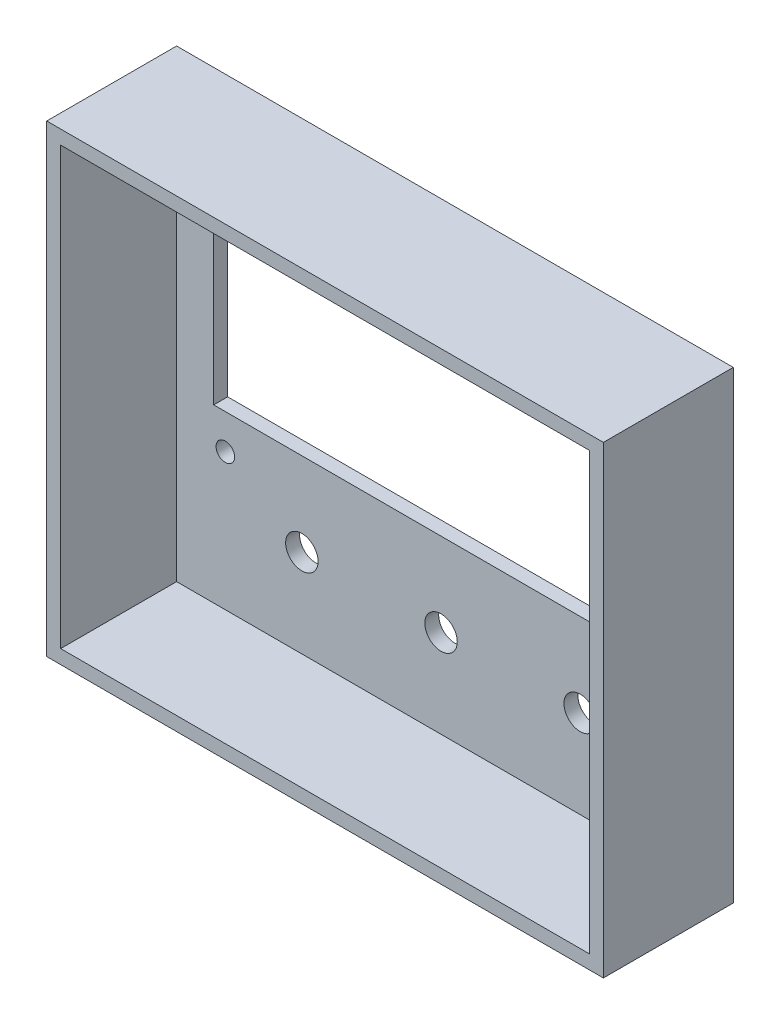
ISO-10303-21;
HEADER;
FILE_DESCRIPTION(('STEP AP214'),'2;1');
FILE_NAME('part.step','',(''),(''),'','','');
FILE_SCHEMA(('AUTOMOTIVE_DESIGN { 1 0 10303 214 1 1 1 1 }'));
ENDSEC;
DATA;
#1=APPLICATION_CONTEXT('core data for automotive mechanical design processes');
#2=APPLICATION_PROTOCOL_DEFINITION('international standard','automotive_design',2000,#1);
#3=PRODUCT_CONTEXT('',#1,'mechanical');
#4=PRODUCT('Part','Part','',(#3));
#5=PRODUCT_RELATED_PRODUCT_CATEGORY('part','',(#4));
#6=PRODUCT_DEFINITION_FORMATION('','',#4);
#7=PRODUCT_DEFINITION_CONTEXT('part definition',#1,'design');
#8=PRODUCT_DEFINITION('design','',#6,#7);
#9=PRODUCT_DEFINITION_SHAPE('','',#8);
#10=(LENGTH_UNIT() NAMED_UNIT(*) SI_UNIT(.MILLI.,.METRE.));
#11=(NAMED_UNIT(*) PLANE_ANGLE_UNIT() SI_UNIT($,.RADIAN.));
#12=(NAMED_UNIT(*) SI_UNIT($,.STERADIAN.) SOLID_ANGLE_UNIT());
#13=UNCERTAINTY_MEASURE_WITH_UNIT(LENGTH_MEASURE(1.E-05),#10,'distance_accuracy_value','');
#14=(GEOMETRIC_REPRESENTATION_CONTEXT(3) GLOBAL_UNCERTAINTY_ASSIGNED_CONTEXT((#13)) GLOBAL_UNIT_ASSIGNED_CONTEXT((#10,
#11,#12)) REPRESENTATION_CONTEXT('',''));
#15=CARTESIAN_POINT('',(0.,0.,0.));
#16=DIRECTION('',(0.,0.,1.));
#17=DIRECTION('',(1.,0.,0.));
#18=AXIS2_PLACEMENT_3D('',#15,#16,#17);
#19=CARTESIAN_POINT('',(0.,0.,3.));
#20=DIRECTION('',(0.,0.,-1.));
#21=DIRECTION('',(-1.,0.,0.));
#22=AXIS2_PLACEMENT_3D('',#19,#20,#21);
#23=PLANE('',#22);
#24=DIRECTION('',(-1.,0.,0.));
#25=VECTOR('',#24,1.);
#26=CARTESIAN_POINT('',(3.,97.,3.));
#27=LINE('',#26,#25);
#28=CARTESIAN_POINT('',(117.,97.,3.));
#29=VERTEX_POINT('',#28);
#30=CARTESIAN_POINT('',(3.,97.,3.));
#31=VERTEX_POINT('',#30);
#32=EDGE_CURVE('E134',#29,#31,#27,.T.);
#33=ORIENTED_EDGE('',*,*,#32,.T.);
#34=DIRECTION('',(0.,-1.,0.));
#35=VECTOR('',#34,1.);
#36=CARTESIAN_POINT('',(3.,3.,3.));
#37=LINE('',#36,#35);
#38=CARTESIAN_POINT('',(3.,3.,3.));
#39=VERTEX_POINT('',#38);
#40=EDGE_CURVE('E153',#31,#39,#37,.T.);
#41=ORIENTED_EDGE('',*,*,#40,.T.);
#42=DIRECTION('',(1.,0.,0.));
#43=VECTOR('',#42,1.);
#44=CARTESIAN_POINT('',(117.,3.,3.));
#45=LINE('',#44,#43);
#46=CARTESIAN_POINT('',(117.,3.,3.));
#47=VERTEX_POINT('',#46);
#48=EDGE_CURVE('E140',#39,#47,#45,.T.);
#49=ORIENTED_EDGE('',*,*,#48,.T.);
#50=DIRECTION('',(0.,1.,0.));
#51=VECTOR('',#50,1.);
#52=CARTESIAN_POINT('',(117.,97.,3.));
#53=LINE('',#52,#51);
#54=EDGE_CURVE('E156',#47,#29,#53,.T.);
#55=ORIENTED_EDGE('',*,*,#54,.T.);
#56=EDGE_LOOP('',(#33,#41,#49,#55));
#57=FACE_BOUND('',#56,.T.);
#58=CARTESIAN_POINT('',(90.,22.,3.));
#59=DIRECTION('',(0.,0.,1.));
#60=DIRECTION('',(1.,0.,0.));
#61=AXIS2_PLACEMENT_3D('',#58,#59,#60);
#62=CIRCLE('',#61,3.50000000000001);
#63=CARTESIAN_POINT('',(93.5,22.,3.));
#64=VERTEX_POINT('',#63);
#65=EDGE_CURVE('E176',#64,#64,#62,.T.);
#66=ORIENTED_EDGE('',*,*,#65,.F.);
#67=EDGE_LOOP('',(#66));
#68=FACE_BOUND('',#67,.T.);
#69=CARTESIAN_POINT('',(60.,22.,3.));
#70=DIRECTION('',(0.,0.,1.));
#71=DIRECTION('',(1.,0.,0.));
#72=AXIS2_PLACEMENT_3D('',#69,#70,#71);
#73=CIRCLE('',#72,3.50000000000001);
#74=CARTESIAN_POINT('',(63.5,22.,3.));
#75=VERTEX_POINT('',#74);
#76=EDGE_CURVE('E210',#75,#75,#73,.T.);
#77=ORIENTED_EDGE('',*,*,#76,.F.);
#78=EDGE_LOOP('',(#77));
#79=FACE_BOUND('',#78,.T.);
#80=CARTESIAN_POINT('',(30.,22.,3.));
#81=DIRECTION('',(0.,0.,1.));
#82=DIRECTION('',(1.,0.,0.));
#83=AXIS2_PLACEMENT_3D('',#80,#81,#82);
#84=CIRCLE('',#83,3.5);
#85=CARTESIAN_POINT('',(33.5,22.,3.));
#86=VERTEX_POINT('',#85);
#87=EDGE_CURVE('E204',#86,#86,#84,.T.);
#88=ORIENTED_EDGE('',*,*,#87,.F.);
#89=EDGE_LOOP('',(#88));
#90=FACE_BOUND('',#89,.T.);
#91=CARTESIAN_POINT('',(13.5,32.5,3.));
#92=DIRECTION('',(0.,0.,1.));
#93=DIRECTION('',(1.,0.,0.));
#94=AXIS2_PLACEMENT_3D('',#91,#92,#93);
#95=CIRCLE('',#94,2.);
#96=CARTESIAN_POINT('',(15.5,32.5,3.));
#97=VERTEX_POINT('',#96);
#98=EDGE_CURVE('E198',#97,#97,#95,.T.);
#99=ORIENTED_EDGE('',*,*,#98,.F.);
#100=EDGE_LOOP('',(#99));
#101=FACE_BOUND('',#100,.T.);
#102=CARTESIAN_POINT('',(106.5,32.5,3.));
#103=DIRECTION('',(0.,0.,1.));
#104=DIRECTION('',(1.,0.,0.));
#105=AXIS2_PLACEMENT_3D('',#102,#103,#104);
#106=CIRCLE('',#105,2.);
#107=CARTESIAN_POINT('',(108.5,32.5,3.));
#108=VERTEX_POINT('',#107);
#109=EDGE_CURVE('E192',#108,#108,#106,.T.);
#110=ORIENTED_EDGE('',*,*,#109,.F.);
#111=EDGE_LOOP('',(#110));
#112=FACE_BOUND('',#111,.T.);
#113=CARTESIAN_POINT('',(106.5,87.5,3.));
#114=DIRECTION('',(0.,0.,1.));
#115=DIRECTION('',(1.,0.,0.));
#116=AXIS2_PLACEMENT_3D('',#113,#114,#115);
#117=CIRCLE('',#116,2.);
#118=CARTESIAN_POINT('',(108.5,87.5,3.));
#119=VERTEX_POINT('',#118);
#120=EDGE_CURVE('E186',#119,#119,#117,.T.);
#121=ORIENTED_EDGE('',*,*,#120,.F.);
#122=EDGE_LOOP('',(#121));
#123=FACE_BOUND('',#122,.T.);
#124=CARTESIAN_POINT('',(13.5,87.5,3.));
#125=DIRECTION('',(0.,0.,1.));
#126=DIRECTION('',(1.,0.,0.));
#127=AXIS2_PLACEMENT_3D('',#124,#125,#126);
#128=CIRCLE('',#127,2.);
#129=CARTESIAN_POINT('',(15.5,87.5,3.));
#130=VERTEX_POINT('',#129);
#131=EDGE_CURVE('E180',#130,#130,#128,.T.);
#132=ORIENTED_EDGE('',*,*,#131,.F.);
#133=EDGE_LOOP('',(#132));
#134=FACE_BOUND('',#133,.T.);
#135=DIRECTION('',(0.,1.,0.));
#136=VECTOR('',#135,1.);
#137=CARTESIAN_POINT('',(11.,0.,3.));
#138=LINE('',#137,#136);
#139=CARTESIAN_POINT('',(11.,40.,3.));
#140=VERTEX_POINT('',#139);
#141=CARTESIAN_POINT('',(11.,80.,3.));
#142=VERTEX_POINT('',#141);
#143=EDGE_CURVE('E56',#140,#142,#138,.T.);
#144=ORIENTED_EDGE('',*,*,#143,.T.);
#145=DIRECTION('',(1.,0.,0.));
#146=VECTOR('',#145,1.);
#147=CARTESIAN_POINT('',(0.,80.,3.));
#148=LINE('',#147,#146);
#149=CARTESIAN_POINT('',(109.,80.,3.));
#150=VERTEX_POINT('',#149);
#151=EDGE_CURVE('E221',#142,#150,#148,.T.);
#152=ORIENTED_EDGE('',*,*,#151,.T.);
#153=DIRECTION('',(0.,-1.,0.));
#154=VECTOR('',#153,1.);
#155=CARTESIAN_POINT('',(109.,0.,3.));
#156=LINE('',#155,#154);
#157=CARTESIAN_POINT('',(109.,40.,3.));
#158=VERTEX_POINT('',#157);
#159=EDGE_CURVE('E233',#150,#158,#156,.T.);
#160=ORIENTED_EDGE('',*,*,#159,.T.);
#161=DIRECTION('',(-1.,0.,0.));
#162=VECTOR('',#161,1.);
#163=CARTESIAN_POINT('',(0.,40.,3.));
#164=LINE('',#163,#162);
#165=EDGE_CURVE('E230',#158,#140,#164,.T.);
#166=ORIENTED_EDGE('',*,*,#165,.T.);
#167=EDGE_LOOP('',(#144,#152,#160,#166));
#168=FACE_BOUND('',#167,.T.);
#169=ADVANCED_FACE('F33',(#57,#68,#79,#90,#101,#112,#123,#134,#168),#23,.F.);
#170=CARTESIAN_POINT('',(0.,0.,0.));
#171=DIRECTION('',(0.,0.,-1.));
#172=DIRECTION('',(-1.,0.,0.));
#173=AXIS2_PLACEMENT_3D('',#170,#171,#172);
#174=PLANE('',#173);
#175=CARTESIAN_POINT('',(90.,22.,0.));
#176=DIRECTION('',(0.,0.,1.));
#177=DIRECTION('',(1.,0.,0.));
#178=AXIS2_PLACEMENT_3D('',#175,#176,#177);
#179=CIRCLE('',#178,3.50000000000001);
#180=CARTESIAN_POINT('',(93.5,22.,0.));
#181=VERTEX_POINT('',#180);
#182=EDGE_CURVE('E213',#181,#181,#179,.T.);
#183=ORIENTED_EDGE('',*,*,#182,.T.);
#184=EDGE_LOOP('',(#183));
#185=FACE_BOUND('',#184,.T.);
#186=CARTESIAN_POINT('',(60.,22.,0.));
#187=DIRECTION('',(0.,0.,1.));
#188=DIRECTION('',(1.,0.,0.));
#189=AXIS2_PLACEMENT_3D('',#186,#187,#188);
#190=CIRCLE('',#189,3.50000000000001);
#191=CARTESIAN_POINT('',(63.5,22.,0.));
#192=VERTEX_POINT('',#191);
#193=EDGE_CURVE('E207',#192,#192,#190,.T.);
#194=ORIENTED_EDGE('',*,*,#193,.T.);
#195=EDGE_LOOP('',(#194));
#196=FACE_BOUND('',#195,.T.);
#197=CARTESIAN_POINT('',(30.,22.,0.));
#198=DIRECTION('',(0.,0.,1.));
#199=DIRECTION('',(1.,0.,0.));
#200=AXIS2_PLACEMENT_3D('',#197,#198,#199);
#201=CIRCLE('',#200,3.5);
#202=CARTESIAN_POINT('',(33.5,22.,0.));
#203=VERTEX_POINT('',#202);
#204=EDGE_CURVE('E201',#203,#203,#201,.T.);
#205=ORIENTED_EDGE('',*,*,#204,.T.);
#206=EDGE_LOOP('',(#205));
#207=FACE_BOUND('',#206,.T.);
#208=CARTESIAN_POINT('',(13.5,32.5,0.));
#209=DIRECTION('',(0.,0.,1.));
#210=DIRECTION('',(1.,0.,0.));
#211=AXIS2_PLACEMENT_3D('',#208,#209,#210);
#212=CIRCLE('',#211,2.);
#213=CARTESIAN_POINT('',(15.5,32.5,0.));
#214=VERTEX_POINT('',#213);
#215=EDGE_CURVE('E195',#214,#214,#212,.T.);
#216=ORIENTED_EDGE('',*,*,#215,.T.);
#217=EDGE_LOOP('',(#216));
#218=FACE_BOUND('',#217,.T.);
#219=CARTESIAN_POINT('',(106.5,32.5,0.));
#220=DIRECTION('',(0.,0.,1.));
#221=DIRECTION('',(1.,0.,0.));
#222=AXIS2_PLACEMENT_3D('',#219,#220,#221);
#223=CIRCLE('',#222,2.);
#224=CARTESIAN_POINT('',(108.5,32.5,0.));
#225=VERTEX_POINT('',#224);
#226=EDGE_CURVE('E189',#225,#225,#223,.T.);
#227=ORIENTED_EDGE('',*,*,#226,.T.);
#228=EDGE_LOOP('',(#227));
#229=FACE_BOUND('',#228,.T.);
#230=CARTESIAN_POINT('',(106.5,87.5,0.));
#231=DIRECTION('',(0.,0.,1.));
#232=DIRECTION('',(1.,0.,0.));
#233=AXIS2_PLACEMENT_3D('',#230,#231,#232);
#234=CIRCLE('',#233,2.);
#235=CARTESIAN_POINT('',(108.5,87.5,0.));
#236=VERTEX_POINT('',#235);
#237=EDGE_CURVE('E183',#236,#236,#234,.T.);
#238=ORIENTED_EDGE('',*,*,#237,.T.);
#239=EDGE_LOOP('',(#238));
#240=FACE_BOUND('',#239,.T.);
#241=CARTESIAN_POINT('',(13.5,87.5,0.));
#242=DIRECTION('',(0.,0.,1.));
#243=DIRECTION('',(1.,0.,0.));
#244=AXIS2_PLACEMENT_3D('',#241,#242,#243);
#245=CIRCLE('',#244,2.);
#246=CARTESIAN_POINT('',(15.5,87.5,0.));
#247=VERTEX_POINT('',#246);
#248=EDGE_CURVE('E177',#247,#247,#245,.T.);
#249=ORIENTED_EDGE('',*,*,#248,.T.);
#250=EDGE_LOOP('',(#249));
#251=FACE_BOUND('',#250,.T.);
#252=DIRECTION('',(1.,0.,0.));
#253=VECTOR('',#252,1.);
#254=CARTESIAN_POINT('',(120.,0.,0.));
#255=LINE('',#254,#253);
#256=CARTESIAN_POINT('',(0.,0.,0.));
#257=VERTEX_POINT('',#256);
#258=CARTESIAN_POINT('',(120.,0.,0.));
#259=VERTEX_POINT('',#258);
#260=EDGE_CURVE('E240',#257,#259,#255,.T.);
#261=ORIENTED_EDGE('',*,*,#260,.F.);
#262=DIRECTION('',(0.,-1.,0.));
#263=VECTOR('',#262,1.);
#264=CARTESIAN_POINT('',(0.,0.,0.));
#265=LINE('',#264,#263);
#266=CARTESIAN_POINT('',(0.,100.,0.));
#267=VERTEX_POINT('',#266);
#268=EDGE_CURVE('E252',#267,#257,#265,.T.);
#269=ORIENTED_EDGE('',*,*,#268,.F.);
#270=DIRECTION('',(-1.,0.,0.));
#271=VECTOR('',#270,1.);
#272=CARTESIAN_POINT('',(0.,100.,0.));
#273=LINE('',#272,#271);
#274=CARTESIAN_POINT('',(120.,100.,0.));
#275=VERTEX_POINT('',#274);
#276=EDGE_CURVE('E250',#275,#267,#273,.T.);
#277=ORIENTED_EDGE('',*,*,#276,.F.);
#278=DIRECTION('',(0.,1.,0.));
#279=VECTOR('',#278,1.);
#280=CARTESIAN_POINT('',(120.,100.,0.));
#281=LINE('',#280,#279);
#282=EDGE_CURVE('E248',#259,#275,#281,.T.);
#283=ORIENTED_EDGE('',*,*,#282,.F.);
#284=EDGE_LOOP('',(#261,#269,#277,#283));
#285=FACE_BOUND('',#284,.T.);
#286=DIRECTION('',(1.,0.,0.));
#287=VECTOR('',#286,1.);
#288=CARTESIAN_POINT('',(0.,80.,0.));
#289=LINE('',#288,#287);
#290=CARTESIAN_POINT('',(11.,80.,0.));
#291=VERTEX_POINT('',#290);
#292=CARTESIAN_POINT('',(109.,80.,0.));
#293=VERTEX_POINT('',#292);
#294=EDGE_CURVE('E226',#291,#293,#289,.T.);
#295=ORIENTED_EDGE('',*,*,#294,.F.);
#296=DIRECTION('',(0.,1.,0.));
#297=VECTOR('',#296,1.);
#298=CARTESIAN_POINT('',(11.,0.,0.));
#299=LINE('',#298,#297);
#300=CARTESIAN_POINT('',(11.,40.,0.));
#301=VERTEX_POINT('',#300);
#302=EDGE_CURVE('E218',#301,#291,#299,.T.);
#303=ORIENTED_EDGE('',*,*,#302,.F.);
#304=DIRECTION('',(-1.,0.,0.));
#305=VECTOR('',#304,1.);
#306=CARTESIAN_POINT('',(0.,40.,0.));
#307=LINE('',#306,#305);
#308=CARTESIAN_POINT('',(109.,40.,0.));
#309=VERTEX_POINT('',#308);
#310=EDGE_CURVE('E220',#309,#301,#307,.T.);
#311=ORIENTED_EDGE('',*,*,#310,.F.);
#312=DIRECTION('',(0.,-1.,0.));
#313=VECTOR('',#312,1.);
#314=CARTESIAN_POINT('',(109.,0.,0.));
#315=LINE('',#314,#313);
#316=EDGE_CURVE('E223',#293,#309,#315,.T.);
#317=ORIENTED_EDGE('',*,*,#316,.F.);
#318=EDGE_LOOP('',(#295,#303,#311,#317));
#319=FACE_BOUND('',#318,.T.);
#320=ADVANCED_FACE('F269',(#185,#196,#207,#218,#229,#240,#251,#285,#319),#174,.T.);
#321=CARTESIAN_POINT('',(120.,0.,3.));
#322=DIRECTION('',(0.,1.,0.));
#323=DIRECTION('',(0.,0.,1.));
#324=AXIS2_PLACEMENT_3D('',#321,#322,#323);
#325=PLANE('',#324);
#326=ORIENTED_EDGE('',*,*,#260,.T.);
#327=DIRECTION('',(0.,0.,-1.));
#328=VECTOR('',#327,1.);
#329=CARTESIAN_POINT('',(120.,0.,3.));
#330=LINE('',#329,#328);
#331=CARTESIAN_POINT('',(120.,0.,28.));
#332=VERTEX_POINT('',#331);
#333=EDGE_CURVE('E11',#332,#259,#330,.T.);
#334=ORIENTED_EDGE('',*,*,#333,.F.);
#335=DIRECTION('',(1.,0.,0.));
#336=VECTOR('',#335,1.);
#337=CARTESIAN_POINT('',(0.,0.,28.));
#338=LINE('',#337,#336);
#339=CARTESIAN_POINT('',(0.,0.,28.));
#340=VERTEX_POINT('',#339);
#341=EDGE_CURVE('E167',#340,#332,#338,.T.);
#342=ORIENTED_EDGE('',*,*,#341,.F.);
#343=DIRECTION('',(0.,0.,-1.));
#344=VECTOR('',#343,1.);
#345=CARTESIAN_POINT('',(0.,0.,3.));
#346=LINE('',#345,#344);
#347=EDGE_CURVE('E254',#340,#257,#346,.T.);
#348=ORIENTED_EDGE('',*,*,#347,.T.);
#349=EDGE_LOOP('',(#326,#334,#342,#348));
#350=FACE_BOUND('',#349,.T.);
#351=ADVANCED_FACE('F35',(#350),#325,.F.);
#352=CARTESIAN_POINT('',(120.,100.,3.));
#353=DIRECTION('',(-1.,0.,0.));
#354=DIRECTION('',(0.,0.,1.));
#355=AXIS2_PLACEMENT_3D('',#352,#353,#354);
#356=PLANE('',#355);
#357=ORIENTED_EDGE('',*,*,#282,.T.);
#358=DIRECTION('',(0.,0.,-1.));
#359=VECTOR('',#358,1.);
#360=CARTESIAN_POINT('',(120.,100.,3.));
#361=LINE('',#360,#359);
#362=CARTESIAN_POINT('',(120.,100.,28.));
#363=VERTEX_POINT('',#362);
#364=EDGE_CURVE('E41',#363,#275,#361,.T.);
#365=ORIENTED_EDGE('',*,*,#364,.F.);
#366=DIRECTION('',(0.,1.,0.));
#367=VECTOR('',#366,1.);
#368=CARTESIAN_POINT('',(120.,100.,28.));
#369=LINE('',#368,#367);
#370=EDGE_CURVE('E170',#332,#363,#369,.T.);
#371=ORIENTED_EDGE('',*,*,#370,.F.);
#372=ORIENTED_EDGE('',*,*,#333,.T.);
#373=EDGE_LOOP('',(#357,#365,#371,#372));
#374=FACE_BOUND('',#373,.T.);
#375=ADVANCED_FACE('F277',(#374),#356,.F.);
#376=CARTESIAN_POINT('',(0.,100.,3.));
#377=DIRECTION('',(0.,-1.,0.));
#378=DIRECTION('',(0.,0.,-1.));
#379=AXIS2_PLACEMENT_3D('',#376,#377,#378);
#380=PLANE('',#379);
#381=ORIENTED_EDGE('',*,*,#276,.T.);
#382=DIRECTION('',(0.,0.,-1.));
#383=VECTOR('',#382,1.);
#384=CARTESIAN_POINT('',(0.,100.,3.));
#385=LINE('',#384,#383);
#386=CARTESIAN_POINT('',(0.,100.,28.));
#387=VERTEX_POINT('',#386);
#388=EDGE_CURVE('E257',#387,#267,#385,.T.);
#389=ORIENTED_EDGE('',*,*,#388,.F.);
#390=DIRECTION('',(-1.,0.,0.));
#391=VECTOR('',#390,1.);
#392=CARTESIAN_POINT('',(0.,100.,28.));
#393=LINE('',#392,#391);
#394=EDGE_CURVE('E173',#363,#387,#393,.T.);
#395=ORIENTED_EDGE('',*,*,#394,.F.);
#396=ORIENTED_EDGE('',*,*,#364,.T.);
#397=EDGE_LOOP('',(#381,#389,#395,#396));
#398=FACE_BOUND('',#397,.T.);
#399=ADVANCED_FACE('F263',(#398),#380,.F.);
#400=CARTESIAN_POINT('',(0.,0.,3.));
#401=DIRECTION('',(1.,0.,0.));
#402=DIRECTION('',(0.,0.,-1.));
#403=AXIS2_PLACEMENT_3D('',#400,#401,#402);
#404=PLANE('',#403);
#405=ORIENTED_EDGE('',*,*,#268,.T.);
#406=ORIENTED_EDGE('',*,*,#347,.F.);
#407=DIRECTION('',(0.,-1.,0.));
#408=VECTOR('',#407,1.);
#409=CARTESIAN_POINT('',(0.,100.,28.));
#410=LINE('',#409,#408);
#411=EDGE_CURVE('E141',#387,#340,#410,.T.);
#412=ORIENTED_EDGE('',*,*,#411,.F.);
#413=ORIENTED_EDGE('',*,*,#388,.T.);
#414=EDGE_LOOP('',(#405,#406,#412,#413));
#415=FACE_BOUND('',#414,.T.);
#416=ADVANCED_FACE('F272',(#415),#404,.F.);
#417=CARTESIAN_POINT('',(11.,0.,0.));
#418=DIRECTION('',(1.,0.,0.));
#419=DIRECTION('',(0.,0.,-1.));
#420=AXIS2_PLACEMENT_3D('',#417,#418,#419);
#421=PLANE('',#420);
#422=ORIENTED_EDGE('',*,*,#143,.F.);
#423=DIRECTION('',(0.,0.,1.));
#424=VECTOR('',#423,1.);
#425=CARTESIAN_POINT('',(11.,40.,0.));
#426=LINE('',#425,#424);
#427=EDGE_CURVE('E228',#301,#140,#426,.T.);
#428=ORIENTED_EDGE('',*,*,#427,.F.);
#429=ORIENTED_EDGE('',*,*,#302,.T.);
#430=DIRECTION('',(0.,0.,1.));
#431=VECTOR('',#430,1.);
#432=CARTESIAN_POINT('',(11.,80.,0.));
#433=LINE('',#432,#431);
#434=EDGE_CURVE('E238',#291,#142,#433,.T.);
#435=ORIENTED_EDGE('',*,*,#434,.T.);
#436=EDGE_LOOP('',(#422,#428,#429,#435));
#437=FACE_BOUND('',#436,.T.);
#438=ADVANCED_FACE('F294',(#437),#421,.T.);
#439=CARTESIAN_POINT('',(0.,80.,0.));
#440=DIRECTION('',(0.,-1.,0.));
#441=DIRECTION('',(0.,0.,-1.));
#442=AXIS2_PLACEMENT_3D('',#439,#440,#441);
#443=PLANE('',#442);
#444=ORIENTED_EDGE('',*,*,#151,.F.);
#445=ORIENTED_EDGE('',*,*,#434,.F.);
#446=ORIENTED_EDGE('',*,*,#294,.T.);
#447=DIRECTION('',(0.,0.,1.));
#448=VECTOR('',#447,1.);
#449=CARTESIAN_POINT('',(109.,80.,0.));
#450=LINE('',#449,#448);
#451=EDGE_CURVE('E241',#293,#150,#450,.T.);
#452=ORIENTED_EDGE('',*,*,#451,.T.);
#453=EDGE_LOOP('',(#444,#445,#446,#452));
#454=FACE_BOUND('',#453,.T.);
#455=ADVANCED_FACE('F301',(#454),#443,.T.);
#456=CARTESIAN_POINT('',(109.,0.,0.));
#457=DIRECTION('',(-1.,0.,0.));
#458=DIRECTION('',(0.,-1.,0.));
#459=AXIS2_PLACEMENT_3D('',#456,#457,#458);
#460=PLANE('',#459);
#461=ORIENTED_EDGE('',*,*,#159,.F.);
#462=ORIENTED_EDGE('',*,*,#451,.F.);
#463=ORIENTED_EDGE('',*,*,#316,.T.);
#464=DIRECTION('',(0.,0.,1.));
#465=VECTOR('',#464,1.);
#466=CARTESIAN_POINT('',(109.,40.,0.));
#467=LINE('',#466,#465);
#468=EDGE_CURVE('E243',#309,#158,#467,.T.);
#469=ORIENTED_EDGE('',*,*,#468,.T.);
#470=EDGE_LOOP('',(#461,#462,#463,#469));
#471=FACE_BOUND('',#470,.T.);
#472=ADVANCED_FACE('F305',(#471),#460,.T.);
#473=CARTESIAN_POINT('',(0.,40.,0.));
#474=DIRECTION('',(0.,1.,0.));
#475=DIRECTION('',(-1.,0.,0.));
#476=AXIS2_PLACEMENT_3D('',#473,#474,#475);
#477=PLANE('',#476);
#478=ORIENTED_EDGE('',*,*,#165,.F.);
#479=ORIENTED_EDGE('',*,*,#468,.F.);
#480=ORIENTED_EDGE('',*,*,#310,.T.);
#481=ORIENTED_EDGE('',*,*,#427,.T.);
#482=EDGE_LOOP('',(#478,#479,#480,#481));
#483=FACE_BOUND('',#482,.T.);
#484=ADVANCED_FACE('F311',(#483),#477,.T.);
#485=CARTESIAN_POINT('',(13.5,87.5,0.));
#486=DIRECTION('',(0.,0.,1.));
#487=DIRECTION('',(1.,0.,0.));
#488=AXIS2_PLACEMENT_3D('',#485,#486,#487);
#489=CYLINDRICAL_SURFACE('',#488,2.);
#490=ORIENTED_EDGE('',*,*,#248,.F.);
#491=EDGE_LOOP('',(#490));
#492=FACE_BOUND('',#491,.T.);
#493=ORIENTED_EDGE('',*,*,#131,.T.);
#494=EDGE_LOOP('',(#493));
#495=FACE_BOUND('',#494,.T.);
#496=ADVANCED_FACE('F318',(#492,#495),#489,.F.);
#497=CARTESIAN_POINT('',(106.5,87.5,0.));
#498=DIRECTION('',(0.,0.,1.));
#499=DIRECTION('',(1.,0.,0.));
#500=AXIS2_PLACEMENT_3D('',#497,#498,#499);
#501=CYLINDRICAL_SURFACE('',#500,2.);
#502=ORIENTED_EDGE('',*,*,#237,.F.);
#503=EDGE_LOOP('',(#502));
#504=FACE_BOUND('',#503,.T.);
#505=ORIENTED_EDGE('',*,*,#120,.T.);
#506=EDGE_LOOP('',(#505));
#507=FACE_BOUND('',#506,.T.);
#508=ADVANCED_FACE('F323',(#504,#507),#501,.F.);
#509=CARTESIAN_POINT('',(106.5,32.5,0.));
#510=DIRECTION('',(0.,0.,1.));
#511=DIRECTION('',(1.,0.,0.));
#512=AXIS2_PLACEMENT_3D('',#509,#510,#511);
#513=CYLINDRICAL_SURFACE('',#512,2.);
#514=ORIENTED_EDGE('',*,*,#226,.F.);
#515=EDGE_LOOP('',(#514));
#516=FACE_BOUND('',#515,.T.);
#517=ORIENTED_EDGE('',*,*,#109,.T.);
#518=EDGE_LOOP('',(#517));
#519=FACE_BOUND('',#518,.T.);
#520=ADVANCED_FACE('F338',(#516,#519),#513,.F.);
#521=CARTESIAN_POINT('',(13.5,32.5,0.));
#522=DIRECTION('',(0.,0.,1.));
#523=DIRECTION('',(1.,0.,0.));
#524=AXIS2_PLACEMENT_3D('',#521,#522,#523);
#525=CYLINDRICAL_SURFACE('',#524,2.);
#526=ORIENTED_EDGE('',*,*,#215,.F.);
#527=EDGE_LOOP('',(#526));
#528=FACE_BOUND('',#527,.T.);
#529=ORIENTED_EDGE('',*,*,#98,.T.);
#530=EDGE_LOOP('',(#529));
#531=FACE_BOUND('',#530,.T.);
#532=ADVANCED_FACE('F348',(#528,#531),#525,.F.);
#533=CARTESIAN_POINT('',(30.,22.,0.));
#534=DIRECTION('',(0.,0.,1.));
#535=DIRECTION('',(1.,0.,0.));
#536=AXIS2_PLACEMENT_3D('',#533,#534,#535);
#537=CYLINDRICAL_SURFACE('',#536,3.5);
#538=ORIENTED_EDGE('',*,*,#204,.F.);
#539=EDGE_LOOP('',(#538));
#540=FACE_BOUND('',#539,.T.);
#541=ORIENTED_EDGE('',*,*,#87,.T.);
#542=EDGE_LOOP('',(#541));
#543=FACE_BOUND('',#542,.T.);
#544=ADVANCED_FACE('F352',(#540,#543),#537,.F.);
#545=CARTESIAN_POINT('',(60.,22.,0.));
#546=DIRECTION('',(0.,0.,1.));
#547=DIRECTION('',(1.,0.,0.));
#548=AXIS2_PLACEMENT_3D('',#545,#546,#547);
#549=CYLINDRICAL_SURFACE('',#548,3.50000000000001);
#550=ORIENTED_EDGE('',*,*,#193,.F.);
#551=EDGE_LOOP('',(#550));
#552=FACE_BOUND('',#551,.T.);
#553=ORIENTED_EDGE('',*,*,#76,.T.);
#554=EDGE_LOOP('',(#553));
#555=FACE_BOUND('',#554,.T.);
#556=ADVANCED_FACE('F355',(#552,#555),#549,.F.);
#557=CARTESIAN_POINT('',(90.,22.,0.));
#558=DIRECTION('',(0.,0.,1.));
#559=DIRECTION('',(1.,0.,0.));
#560=AXIS2_PLACEMENT_3D('',#557,#558,#559);
#561=CYLINDRICAL_SURFACE('',#560,3.50000000000001);
#562=ORIENTED_EDGE('',*,*,#182,.F.);
#563=EDGE_LOOP('',(#562));
#564=FACE_BOUND('',#563,.T.);
#565=ORIENTED_EDGE('',*,*,#65,.T.);
#566=EDGE_LOOP('',(#565));
#567=FACE_BOUND('',#566,.T.);
#568=ADVANCED_FACE('F315',(#564,#567),#561,.F.);
#569=CARTESIAN_POINT('',(0.,0.,28.));
#570=DIRECTION('',(0.,0.,1.));
#571=DIRECTION('',(1.,0.,0.));
#572=AXIS2_PLACEMENT_3D('',#569,#570,#571);
#573=PLANE('',#572);
#574=ORIENTED_EDGE('',*,*,#411,.T.);
#575=ORIENTED_EDGE('',*,*,#341,.T.);
#576=ORIENTED_EDGE('',*,*,#370,.T.);
#577=ORIENTED_EDGE('',*,*,#394,.T.);
#578=EDGE_LOOP('',(#574,#575,#576,#577));
#579=FACE_BOUND('',#578,.T.);
#580=DIRECTION('',(1.,0.,0.));
#581=VECTOR('',#580,1.);
#582=CARTESIAN_POINT('',(117.,3.,28.));
#583=LINE('',#582,#581);
#584=CARTESIAN_POINT('',(3.,3.,28.));
#585=VERTEX_POINT('',#584);
#586=CARTESIAN_POINT('',(117.,3.,28.));
#587=VERTEX_POINT('',#586);
#588=EDGE_CURVE('E133',#585,#587,#583,.T.);
#589=ORIENTED_EDGE('',*,*,#588,.F.);
#590=DIRECTION('',(0.,-1.,0.));
#591=VECTOR('',#590,1.);
#592=CARTESIAN_POINT('',(3.,3.,28.));
#593=LINE('',#592,#591);
#594=CARTESIAN_POINT('',(3.,97.,28.));
#595=VERTEX_POINT('',#594);
#596=EDGE_CURVE('E125',#595,#585,#593,.T.);
#597=ORIENTED_EDGE('',*,*,#596,.F.);
#598=DIRECTION('',(-1.,0.,0.));
#599=VECTOR('',#598,1.);
#600=CARTESIAN_POINT('',(3.,97.,28.));
#601=LINE('',#600,#599);
#602=CARTESIAN_POINT('',(117.,97.,28.));
#603=VERTEX_POINT('',#602);
#604=EDGE_CURVE('E149',#603,#595,#601,.T.);
#605=ORIENTED_EDGE('',*,*,#604,.F.);
#606=DIRECTION('',(0.,1.,0.));
#607=VECTOR('',#606,1.);
#608=CARTESIAN_POINT('',(117.,97.,28.));
#609=LINE('',#608,#607);
#610=EDGE_CURVE('E147',#587,#603,#609,.T.);
#611=ORIENTED_EDGE('',*,*,#610,.F.);
#612=EDGE_LOOP('',(#589,#597,#605,#611));
#613=FACE_BOUND('',#612,.T.);
#614=ADVANCED_FACE('F145',(#579,#613),#573,.T.);
#615=CARTESIAN_POINT('',(3.,3.,28.));
#616=DIRECTION('',(1.,0.,0.));
#617=DIRECTION('',(0.,0.,-1.));
#618=AXIS2_PLACEMENT_3D('',#615,#616,#617);
#619=PLANE('',#618);
#620=ORIENTED_EDGE('',*,*,#40,.F.);
#621=DIRECTION('',(0.,0.,-1.));
#622=VECTOR('',#621,1.);
#623=CARTESIAN_POINT('',(3.,97.,28.));
#624=LINE('',#623,#622);
#625=EDGE_CURVE('E48',#595,#31,#624,.T.);
#626=ORIENTED_EDGE('',*,*,#625,.F.);
#627=ORIENTED_EDGE('',*,*,#596,.T.);
#628=DIRECTION('',(0.,0.,-1.));
#629=VECTOR('',#628,1.);
#630=CARTESIAN_POINT('',(3.,3.,28.));
#631=LINE('',#630,#629);
#632=EDGE_CURVE('E128',#585,#39,#631,.T.);
#633=ORIENTED_EDGE('',*,*,#632,.T.);
#634=EDGE_LOOP('',(#620,#626,#627,#633));
#635=FACE_BOUND('',#634,.T.);
#636=ADVANCED_FACE('F127',(#635),#619,.T.);
#637=CARTESIAN_POINT('',(117.,3.,28.));
#638=DIRECTION('',(0.,1.,0.));
#639=DIRECTION('',(0.,0.,1.));
#640=AXIS2_PLACEMENT_3D('',#637,#638,#639);
#641=PLANE('',#640);
#642=ORIENTED_EDGE('',*,*,#48,.F.);
#643=ORIENTED_EDGE('',*,*,#632,.F.);
#644=ORIENTED_EDGE('',*,*,#588,.T.);
#645=DIRECTION('',(0.,0.,-1.));
#646=VECTOR('',#645,1.);
#647=CARTESIAN_POINT('',(117.,3.,28.));
#648=LINE('',#647,#646);
#649=EDGE_CURVE('E142',#587,#47,#648,.T.);
#650=ORIENTED_EDGE('',*,*,#649,.T.);
#651=EDGE_LOOP('',(#642,#643,#644,#650));
#652=FACE_BOUND('',#651,.T.);
#653=ADVANCED_FACE('F137',(#652),#641,.T.);
#654=CARTESIAN_POINT('',(117.,97.,28.));
#655=DIRECTION('',(-1.,0.,0.));
#656=DIRECTION('',(0.,-1.,0.));
#657=AXIS2_PLACEMENT_3D('',#654,#655,#656);
#658=PLANE('',#657);
#659=ORIENTED_EDGE('',*,*,#54,.F.);
#660=ORIENTED_EDGE('',*,*,#649,.F.);
#661=ORIENTED_EDGE('',*,*,#610,.T.);
#662=DIRECTION('',(0.,0.,-1.));
#663=VECTOR('',#662,1.);
#664=CARTESIAN_POINT('',(117.,97.,28.));
#665=LINE('',#664,#663);
#666=EDGE_CURVE('E162',#603,#29,#665,.T.);
#667=ORIENTED_EDGE('',*,*,#666,.T.);
#668=EDGE_LOOP('',(#659,#660,#661,#667));
#669=FACE_BOUND('',#668,.T.);
#670=ADVANCED_FACE('F403',(#669),#658,.T.);
#671=CARTESIAN_POINT('',(3.,97.,28.));
#672=DIRECTION('',(0.,-1.,0.));
#673=DIRECTION('',(0.,0.,-1.));
#674=AXIS2_PLACEMENT_3D('',#671,#672,#673);
#675=PLANE('',#674);
#676=ORIENTED_EDGE('',*,*,#32,.F.);
#677=ORIENTED_EDGE('',*,*,#666,.F.);
#678=ORIENTED_EDGE('',*,*,#604,.T.);
#679=ORIENTED_EDGE('',*,*,#625,.T.);
#680=EDGE_LOOP('',(#676,#677,#678,#679));
#681=FACE_BOUND('',#680,.T.);
#682=ADVANCED_FACE('F408',(#681),#675,.T.);
#683=CLOSED_SHELL('',(#169,#320,#351,#375,#399,#416,#438,#455,#472,#484,#496,#508,#520,#532,
#544,#556,#568,#614,#636,#653,#670,#682));
#684=MANIFOLD_SOLID_BREP('B2',#683);
#685=ADVANCED_BREP_SHAPE_REPRESENTATION('',(#18,#684),#14);
#686=SHAPE_DEFINITION_REPRESENTATION(#9,#685);
ENDSEC;
END-ISO-10303-21;
